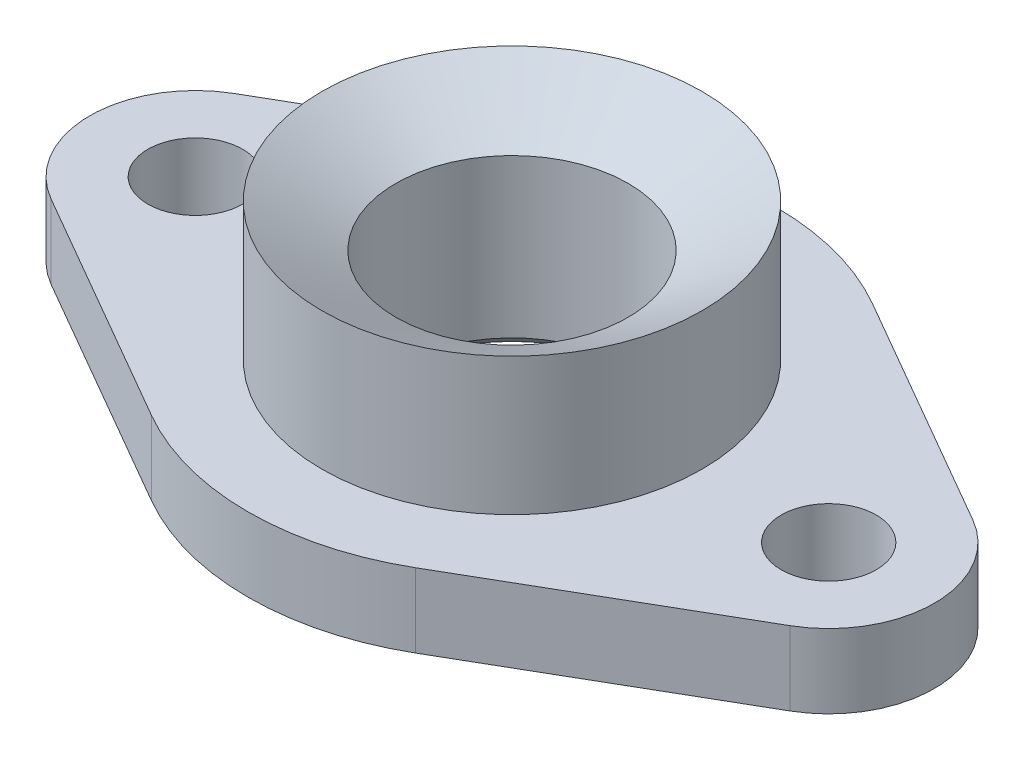
ISO-10303-21;
HEADER;
FILE_DESCRIPTION(('STEP AP214'),'2;1');
FILE_NAME('part.step','',(''),(''),'','','');
FILE_SCHEMA(('AUTOMOTIVE_DESIGN { 1 0 10303 214 1 1 1 1 }'));
ENDSEC;
DATA;
#1=APPLICATION_CONTEXT('core data for automotive mechanical design processes');
#2=APPLICATION_PROTOCOL_DEFINITION('international standard','automotive_design',2000,#1);
#3=PRODUCT_CONTEXT('',#1,'mechanical');
#4=PRODUCT('Part','Part','',(#3));
#5=PRODUCT_RELATED_PRODUCT_CATEGORY('part','',(#4));
#6=PRODUCT_DEFINITION_FORMATION('','',#4);
#7=PRODUCT_DEFINITION_CONTEXT('part definition',#1,'design');
#8=PRODUCT_DEFINITION('design','',#6,#7);
#9=PRODUCT_DEFINITION_SHAPE('','',#8);
#10=(LENGTH_UNIT() NAMED_UNIT(*) SI_UNIT(.MILLI.,.METRE.));
#11=(NAMED_UNIT(*) PLANE_ANGLE_UNIT() SI_UNIT($,.RADIAN.));
#12=(NAMED_UNIT(*) SI_UNIT($,.STERADIAN.) SOLID_ANGLE_UNIT());
#13=UNCERTAINTY_MEASURE_WITH_UNIT(LENGTH_MEASURE(1.E-05),#10,'distance_accuracy_value','');
#14=(GEOMETRIC_REPRESENTATION_CONTEXT(3) GLOBAL_UNCERTAINTY_ASSIGNED_CONTEXT((#13)) GLOBAL_UNIT_ASSIGNED_CONTEXT((#10,
#11,#12)) REPRESENTATION_CONTEXT('',''));
#15=CARTESIAN_POINT('',(0.,0.,0.));
#16=DIRECTION('',(0.,0.,1.));
#17=DIRECTION('',(1.,0.,0.));
#18=AXIS2_PLACEMENT_3D('',#15,#16,#17);
#19=CARTESIAN_POINT('',(0.,0.,0.));
#20=DIRECTION('',(0.,1.,0.));
#21=DIRECTION('',(0.,0.,1.));
#22=AXIS2_PLACEMENT_3D('',#19,#20,#21);
#23=PLANE('',#22);
#24=CARTESIAN_POINT('',(0.,0.,0.));
#25=DIRECTION('',(0.,1.,0.));
#26=DIRECTION('',(0.,0.,1.));
#27=AXIS2_PLACEMENT_3D('',#24,#25,#26);
#28=CIRCLE('',#27,12.);
#29=CARTESIAN_POINT('',(0.,0.,12.));
#30=VERTEX_POINT('',#29);
#31=EDGE_CURVE('E11',#30,#30,#28,.T.);
#32=ORIENTED_EDGE('',*,*,#31,.T.);
#33=EDGE_LOOP('',(#32));
#34=FACE_BOUND('',#33,.T.);
#35=CARTESIAN_POINT('',(30.,0.,0.));
#36=DIRECTION('',(0.,1.,0.));
#37=DIRECTION('',(0.,0.,1.));
#38=AXIS2_PLACEMENT_3D('',#35,#36,#37);
#39=CIRCLE('',#38,4.5);
#40=CARTESIAN_POINT('',(30.,0.,4.49999999999999));
#41=VERTEX_POINT('',#40);
#42=EDGE_CURVE('E238',#41,#41,#39,.T.);
#43=ORIENTED_EDGE('',*,*,#42,.T.);
#44=EDGE_LOOP('',(#43));
#45=FACE_BOUND('',#44,.T.);
#46=CARTESIAN_POINT('',(0.,0.,0.));
#47=DIRECTION('',(0.,1.,0.));
#48=DIRECTION('',(0.,0.,1.));
#49=AXIS2_PLACEMENT_3D('',#46,#47,#48);
#50=CIRCLE('',#49,25.);
#51=CARTESIAN_POINT('',(12.5,0.,-21.650635094611));
#52=VERTEX_POINT('',#51);
#53=CARTESIAN_POINT('',(-12.5,0.,-21.650635094611));
#54=VERTEX_POINT('',#53);
#55=EDGE_CURVE('E133',#52,#54,#50,.T.);
#56=ORIENTED_EDGE('',*,*,#55,.F.);
#57=DIRECTION('',(-0.866025403784439,0.,-0.5));
#58=VECTOR('',#57,1.);
#59=CARTESIAN_POINT('',(12.5,0.,-21.650635094611));
#60=LINE('',#59,#58);
#61=CARTESIAN_POINT('',(35.,0.,-8.6602540378444));
#62=VERTEX_POINT('',#61);
#63=EDGE_CURVE('E86',#62,#52,#60,.T.);
#64=ORIENTED_EDGE('',*,*,#63,.F.);
#65=CARTESIAN_POINT('',(30.,0.,0.));
#66=DIRECTION('',(0.,1.,0.));
#67=DIRECTION('',(0.,0.,-1.));
#68=AXIS2_PLACEMENT_3D('',#65,#66,#67);
#69=CIRCLE('',#68,10.);
#70=CARTESIAN_POINT('',(35.,0.,8.66025403784438));
#71=VERTEX_POINT('',#70);
#72=EDGE_CURVE('E80',#71,#62,#69,.T.);
#73=ORIENTED_EDGE('',*,*,#72,.F.);
#74=DIRECTION('',(0.866025403784438,0.,-0.5));
#75=VECTOR('',#74,1.);
#76=CARTESIAN_POINT('',(12.5,0.,21.650635094611));
#77=LINE('',#76,#75);
#78=CARTESIAN_POINT('',(12.5,0.,21.650635094611));
#79=VERTEX_POINT('',#78);
#80=EDGE_CURVE('E123',#79,#71,#77,.T.);
#81=ORIENTED_EDGE('',*,*,#80,.F.);
#82=CARTESIAN_POINT('',(0.,0.,0.));
#83=DIRECTION('',(0.,1.,0.));
#84=DIRECTION('',(0.,0.,1.));
#85=AXIS2_PLACEMENT_3D('',#82,#83,#84);
#86=CIRCLE('',#85,25.);
#87=CARTESIAN_POINT('',(-12.5,0.,21.650635094611));
#88=VERTEX_POINT('',#87);
#89=EDGE_CURVE('E143',#88,#79,#86,.T.);
#90=ORIENTED_EDGE('',*,*,#89,.F.);
#91=DIRECTION('',(0.866025403784439,0.,0.5));
#92=VECTOR('',#91,1.);
#93=CARTESIAN_POINT('',(-35.,0.,8.66025403784439));
#94=LINE('',#93,#92);
#95=CARTESIAN_POINT('',(-35.,0.,8.66025403784438));
#96=VERTEX_POINT('',#95);
#97=EDGE_CURVE('E141',#96,#88,#94,.T.);
#98=ORIENTED_EDGE('',*,*,#97,.F.);
#99=CARTESIAN_POINT('',(-30.,0.,0.));
#100=DIRECTION('',(0.,1.,0.));
#101=DIRECTION('',(0.,0.,1.));
#102=AXIS2_PLACEMENT_3D('',#99,#100,#101);
#103=CIRCLE('',#102,10.);
#104=CARTESIAN_POINT('',(-35.,0.,-8.66025403784438));
#105=VERTEX_POINT('',#104);
#106=EDGE_CURVE('E139',#105,#96,#103,.T.);
#107=ORIENTED_EDGE('',*,*,#106,.F.);
#108=DIRECTION('',(-0.866025403784438,0.,0.500000000000001));
#109=VECTOR('',#108,1.);
#110=CARTESIAN_POINT('',(-12.5,0.,-21.650635094611));
#111=LINE('',#110,#109);
#112=EDGE_CURVE('E136',#54,#105,#111,.T.);
#113=ORIENTED_EDGE('',*,*,#112,.F.);
#114=EDGE_LOOP('',(#56,#64,#73,#81,#90,#98,#107,#113));
#115=FACE_BOUND('',#114,.T.);
#116=CARTESIAN_POINT('',(-30.,0.,0.));
#117=DIRECTION('',(0.,1.,0.));
#118=DIRECTION('',(0.,0.,1.));
#119=AXIS2_PLACEMENT_3D('',#116,#117,#118);
#120=CIRCLE('',#119,4.5);
#121=CARTESIAN_POINT('',(-30.,0.,4.5));
#122=VERTEX_POINT('',#121);
#123=EDGE_CURVE('E232',#122,#122,#120,.T.);
#124=ORIENTED_EDGE('',*,*,#123,.T.);
#125=EDGE_LOOP('',(#124));
#126=FACE_BOUND('',#125,.T.);
#127=ADVANCED_FACE('F34',(#34,#45,#115,#126),#23,.F.);
#128=CARTESIAN_POINT('',(0.,7.,0.));
#129=DIRECTION('',(0.,1.,0.));
#130=DIRECTION('',(0.,0.,1.));
#131=AXIS2_PLACEMENT_3D('',#128,#129,#130);
#132=PLANE('',#131);
#133=CARTESIAN_POINT('',(30.,7.,0.));
#134=DIRECTION('',(0.,1.,0.));
#135=DIRECTION('',(0.,0.,1.));
#136=AXIS2_PLACEMENT_3D('',#133,#134,#135);
#137=CIRCLE('',#136,4.5);
#138=CARTESIAN_POINT('',(30.,7.,4.49999999999999));
#139=VERTEX_POINT('',#138);
#140=EDGE_CURVE('E235',#139,#139,#137,.T.);
#141=ORIENTED_EDGE('',*,*,#140,.F.);
#142=EDGE_LOOP('',(#141));
#143=FACE_BOUND('',#142,.T.);
#144=CARTESIAN_POINT('',(0.,7.,0.));
#145=DIRECTION('',(0.,1.,0.));
#146=DIRECTION('',(0.,0.,1.));
#147=AXIS2_PLACEMENT_3D('',#144,#145,#146);
#148=CIRCLE('',#147,25.);
#149=CARTESIAN_POINT('',(12.5,7.,-21.650635094611));
#150=VERTEX_POINT('',#149);
#151=CARTESIAN_POINT('',(-12.5,7.,-21.650635094611));
#152=VERTEX_POINT('',#151);
#153=EDGE_CURVE('E148',#150,#152,#148,.T.);
#154=ORIENTED_EDGE('',*,*,#153,.T.);
#155=DIRECTION('',(-0.866025403784438,0.,0.500000000000001));
#156=VECTOR('',#155,1.);
#157=CARTESIAN_POINT('',(-12.5,7.,-21.650635094611));
#158=LINE('',#157,#156);
#159=CARTESIAN_POINT('',(-35.,7.,-8.66025403784438));
#160=VERTEX_POINT('',#159);
#161=EDGE_CURVE('E95',#152,#160,#158,.T.);
#162=ORIENTED_EDGE('',*,*,#161,.T.);
#163=CARTESIAN_POINT('',(-30.,7.,0.));
#164=DIRECTION('',(0.,1.,0.));
#165=DIRECTION('',(0.,0.,1.));
#166=AXIS2_PLACEMENT_3D('',#163,#164,#165);
#167=CIRCLE('',#166,10.);
#168=CARTESIAN_POINT('',(-35.,7.,8.66025403784438));
#169=VERTEX_POINT('',#168);
#170=EDGE_CURVE('E224',#160,#169,#167,.T.);
#171=ORIENTED_EDGE('',*,*,#170,.T.);
#172=DIRECTION('',(0.866025403784439,0.,0.5));
#173=VECTOR('',#172,1.);
#174=CARTESIAN_POINT('',(-35.,7.,8.66025403784439));
#175=LINE('',#174,#173);
#176=CARTESIAN_POINT('',(-12.5,7.,21.650635094611));
#177=VERTEX_POINT('',#176);
#178=EDGE_CURVE('E226',#169,#177,#175,.T.);
#179=ORIENTED_EDGE('',*,*,#178,.T.);
#180=CARTESIAN_POINT('',(0.,7.,0.));
#181=DIRECTION('',(0.,1.,0.));
#182=DIRECTION('',(0.,0.,1.));
#183=AXIS2_PLACEMENT_3D('',#180,#181,#182);
#184=CIRCLE('',#183,25.);
#185=CARTESIAN_POINT('',(12.5,7.,21.650635094611));
#186=VERTEX_POINT('',#185);
#187=EDGE_CURVE('E115',#177,#186,#184,.T.);
#188=ORIENTED_EDGE('',*,*,#187,.T.);
#189=DIRECTION('',(0.866025403784438,0.,-0.5));
#190=VECTOR('',#189,1.);
#191=CARTESIAN_POINT('',(12.5,7.,21.650635094611));
#192=LINE('',#191,#190);
#193=CARTESIAN_POINT('',(35.,7.,8.66025403784438));
#194=VERTEX_POINT('',#193);
#195=EDGE_CURVE('E108',#186,#194,#192,.T.);
#196=ORIENTED_EDGE('',*,*,#195,.T.);
#197=CARTESIAN_POINT('',(30.,7.,0.));
#198=DIRECTION('',(0.,1.,0.));
#199=DIRECTION('',(0.,0.,-1.));
#200=AXIS2_PLACEMENT_3D('',#197,#198,#199);
#201=CIRCLE('',#200,10.);
#202=CARTESIAN_POINT('',(35.,7.,-8.6602540378444));
#203=VERTEX_POINT('',#202);
#204=EDGE_CURVE('E113',#194,#203,#201,.T.);
#205=ORIENTED_EDGE('',*,*,#204,.T.);
#206=DIRECTION('',(-0.866025403784439,0.,-0.5));
#207=VECTOR('',#206,1.);
#208=CARTESIAN_POINT('',(12.5,7.,-21.650635094611));
#209=LINE('',#208,#207);
#210=EDGE_CURVE('E51',#203,#150,#209,.T.);
#211=ORIENTED_EDGE('',*,*,#210,.T.);
#212=EDGE_LOOP('',(#154,#162,#171,#179,#188,#196,#205,#211));
#213=FACE_BOUND('',#212,.T.);
#214=CARTESIAN_POINT('',(-30.,7.,0.));
#215=DIRECTION('',(0.,1.,0.));
#216=DIRECTION('',(0.,0.,1.));
#217=AXIS2_PLACEMENT_3D('',#214,#215,#216);
#218=CIRCLE('',#217,4.5);
#219=CARTESIAN_POINT('',(-30.,7.,4.5));
#220=VERTEX_POINT('',#219);
#221=EDGE_CURVE('E137',#220,#220,#218,.T.);
#222=ORIENTED_EDGE('',*,*,#221,.F.);
#223=EDGE_LOOP('',(#222));
#224=FACE_BOUND('',#223,.T.);
#225=CARTESIAN_POINT('',(0.,7.,0.));
#226=DIRECTION('',(0.,1.,0.));
#227=DIRECTION('',(0.,0.,1.));
#228=AXIS2_PLACEMENT_3D('',#225,#226,#227);
#229=CIRCLE('',#228,18.);
#230=CARTESIAN_POINT('',(0.,7.,-18.));
#231=VERTEX_POINT('',#230);
#232=EDGE_CURVE('E241',#231,#231,#229,.T.);
#233=ORIENTED_EDGE('',*,*,#232,.F.);
#234=EDGE_LOOP('',(#233));
#235=FACE_BOUND('',#234,.T.);
#236=ADVANCED_FACE('F110',(#143,#213,#224,#235),#132,.T.);
#237=CARTESIAN_POINT('',(0.,7.,0.));
#238=DIRECTION('',(0.,-1.,0.));
#239=DIRECTION('',(0.,0.,-1.));
#240=AXIS2_PLACEMENT_3D('',#237,#238,#239);
#241=CYLINDRICAL_SURFACE('',#240,25.);
#242=ORIENTED_EDGE('',*,*,#55,.T.);
#243=DIRECTION('',(0.,-1.,0.));
#244=VECTOR('',#243,1.);
#245=CARTESIAN_POINT('',(-12.5,7.,-21.650635094611));
#246=LINE('',#245,#244);
#247=EDGE_CURVE('E161',#152,#54,#246,.T.);
#248=ORIENTED_EDGE('',*,*,#247,.F.);
#249=ORIENTED_EDGE('',*,*,#153,.F.);
#250=DIRECTION('',(0.,-1.,0.));
#251=VECTOR('',#250,1.);
#252=CARTESIAN_POINT('',(12.5,7.,-21.650635094611));
#253=LINE('',#252,#251);
#254=EDGE_CURVE('E129',#150,#52,#253,.T.);
#255=ORIENTED_EDGE('',*,*,#254,.T.);
#256=EDGE_LOOP('',(#242,#248,#249,#255));
#257=FACE_BOUND('',#256,.T.);
#258=ADVANCED_FACE('F183',(#257),#241,.T.);
#259=CARTESIAN_POINT('',(-12.5,7.,-21.650635094611));
#260=DIRECTION('',(0.500000000000001,0.,0.866025403784438));
#261=DIRECTION('',(0.866025403784438,0.,-0.500000000000001));
#262=AXIS2_PLACEMENT_3D('',#259,#260,#261);
#263=PLANE('',#262);
#264=ORIENTED_EDGE('',*,*,#112,.T.);
#265=DIRECTION('',(0.,-1.,0.));
#266=VECTOR('',#265,1.);
#267=CARTESIAN_POINT('',(-35.,7.,-8.66025403784438));
#268=LINE('',#267,#266);
#269=EDGE_CURVE('E158',#160,#105,#268,.T.);
#270=ORIENTED_EDGE('',*,*,#269,.F.);
#271=ORIENTED_EDGE('',*,*,#161,.F.);
#272=ORIENTED_EDGE('',*,*,#247,.T.);
#273=EDGE_LOOP('',(#264,#270,#271,#272));
#274=FACE_BOUND('',#273,.T.);
#275=ADVANCED_FACE('F208',(#274),#263,.F.);
#276=CARTESIAN_POINT('',(-30.,7.,0.));
#277=DIRECTION('',(0.,-1.,0.));
#278=DIRECTION('',(0.,0.,-1.));
#279=AXIS2_PLACEMENT_3D('',#276,#277,#278);
#280=CYLINDRICAL_SURFACE('',#279,10.);
#281=ORIENTED_EDGE('',*,*,#106,.T.);
#282=DIRECTION('',(0.,-1.,0.));
#283=VECTOR('',#282,1.);
#284=CARTESIAN_POINT('',(-35.,7.,8.66025403784438));
#285=LINE('',#284,#283);
#286=EDGE_CURVE('E155',#169,#96,#285,.T.);
#287=ORIENTED_EDGE('',*,*,#286,.F.);
#288=ORIENTED_EDGE('',*,*,#170,.F.);
#289=ORIENTED_EDGE('',*,*,#269,.T.);
#290=EDGE_LOOP('',(#281,#287,#288,#289));
#291=FACE_BOUND('',#290,.T.);
#292=ADVANCED_FACE('F204',(#291),#280,.T.);
#293=CARTESIAN_POINT('',(-35.,7.,8.66025403784439));
#294=DIRECTION('',(0.5,0.,-0.866025403784439));
#295=DIRECTION('',(-0.866025403784439,0.,-0.5));
#296=AXIS2_PLACEMENT_3D('',#293,#294,#295);
#297=PLANE('',#296);
#298=ORIENTED_EDGE('',*,*,#97,.T.);
#299=DIRECTION('',(0.,-1.,0.));
#300=VECTOR('',#299,1.);
#301=CARTESIAN_POINT('',(-12.5,7.,21.650635094611));
#302=LINE('',#301,#300);
#303=EDGE_CURVE('E152',#177,#88,#302,.T.);
#304=ORIENTED_EDGE('',*,*,#303,.F.);
#305=ORIENTED_EDGE('',*,*,#178,.F.);
#306=ORIENTED_EDGE('',*,*,#286,.T.);
#307=EDGE_LOOP('',(#298,#304,#305,#306));
#308=FACE_BOUND('',#307,.T.);
#309=ADVANCED_FACE('F200',(#308),#297,.F.);
#310=CARTESIAN_POINT('',(0.,7.,0.));
#311=DIRECTION('',(0.,-1.,0.));
#312=DIRECTION('',(0.,0.,-1.));
#313=AXIS2_PLACEMENT_3D('',#310,#311,#312);
#314=CYLINDRICAL_SURFACE('',#313,25.);
#315=ORIENTED_EDGE('',*,*,#89,.T.);
#316=DIRECTION('',(0.,-1.,0.));
#317=VECTOR('',#316,1.);
#318=CARTESIAN_POINT('',(12.5,7.,21.650635094611));
#319=LINE('',#318,#317);
#320=EDGE_CURVE('E124',#186,#79,#319,.T.);
#321=ORIENTED_EDGE('',*,*,#320,.F.);
#322=ORIENTED_EDGE('',*,*,#187,.F.);
#323=ORIENTED_EDGE('',*,*,#303,.T.);
#324=EDGE_LOOP('',(#315,#321,#322,#323));
#325=FACE_BOUND('',#324,.T.);
#326=ADVANCED_FACE('F197',(#325),#314,.T.);
#327=CARTESIAN_POINT('',(12.5,7.,21.650635094611));
#328=DIRECTION('',(-0.5,0.,-0.866025403784438));
#329=DIRECTION('',(-0.866025403784438,0.,0.5));
#330=AXIS2_PLACEMENT_3D('',#327,#328,#329);
#331=PLANE('',#330);
#332=ORIENTED_EDGE('',*,*,#80,.T.);
#333=DIRECTION('',(0.,-1.,0.));
#334=VECTOR('',#333,1.);
#335=CARTESIAN_POINT('',(35.,7.,8.66025403784438));
#336=LINE('',#335,#334);
#337=EDGE_CURVE('E120',#194,#71,#336,.T.);
#338=ORIENTED_EDGE('',*,*,#337,.F.);
#339=ORIENTED_EDGE('',*,*,#195,.F.);
#340=ORIENTED_EDGE('',*,*,#320,.T.);
#341=EDGE_LOOP('',(#332,#338,#339,#340));
#342=FACE_BOUND('',#341,.T.);
#343=ADVANCED_FACE('F121',(#342),#331,.F.);
#344=CARTESIAN_POINT('',(30.,7.,0.));
#345=DIRECTION('',(0.,-1.,0.));
#346=DIRECTION('',(0.,0.,-1.));
#347=AXIS2_PLACEMENT_3D('',#344,#345,#346);
#348=CYLINDRICAL_SURFACE('',#347,10.);
#349=ORIENTED_EDGE('',*,*,#72,.T.);
#350=DIRECTION('',(0.,-1.,0.));
#351=VECTOR('',#350,1.);
#352=CARTESIAN_POINT('',(35.,7.,-8.6602540378444));
#353=LINE('',#352,#351);
#354=EDGE_CURVE('E125',#203,#62,#353,.T.);
#355=ORIENTED_EDGE('',*,*,#354,.F.);
#356=ORIENTED_EDGE('',*,*,#204,.F.);
#357=ORIENTED_EDGE('',*,*,#337,.T.);
#358=EDGE_LOOP('',(#349,#355,#356,#357));
#359=FACE_BOUND('',#358,.T.);
#360=ADVANCED_FACE('F127',(#359),#348,.T.);
#361=CARTESIAN_POINT('',(12.5,7.,-21.650635094611));
#362=DIRECTION('',(-0.5,0.,0.866025403784439));
#363=DIRECTION('',(0.866025403784439,0.,0.5));
#364=AXIS2_PLACEMENT_3D('',#361,#362,#363);
#365=PLANE('',#364);
#366=ORIENTED_EDGE('',*,*,#63,.T.);
#367=ORIENTED_EDGE('',*,*,#254,.F.);
#368=ORIENTED_EDGE('',*,*,#210,.F.);
#369=ORIENTED_EDGE('',*,*,#354,.T.);
#370=EDGE_LOOP('',(#366,#367,#368,#369));
#371=FACE_BOUND('',#370,.T.);
#372=ADVANCED_FACE('F189',(#371),#365,.F.);
#373=CARTESIAN_POINT('',(-30.,7.,0.));
#374=DIRECTION('',(0.,-1.,0.));
#375=DIRECTION('',(0.,0.,-1.));
#376=AXIS2_PLACEMENT_3D('',#373,#374,#375);
#377=CYLINDRICAL_SURFACE('',#376,4.5);
#378=ORIENTED_EDGE('',*,*,#221,.T.);
#379=EDGE_LOOP('',(#378));
#380=FACE_BOUND('',#379,.T.);
#381=ORIENTED_EDGE('',*,*,#123,.F.);
#382=EDGE_LOOP('',(#381));
#383=FACE_BOUND('',#382,.T.);
#384=ADVANCED_FACE('F192',(#380,#383),#377,.F.);
#385=CARTESIAN_POINT('',(30.,7.,0.));
#386=DIRECTION('',(0.,-1.,0.));
#387=DIRECTION('',(0.,0.,-1.));
#388=AXIS2_PLACEMENT_3D('',#385,#386,#387);
#389=CYLINDRICAL_SURFACE('',#388,4.5);
#390=ORIENTED_EDGE('',*,*,#140,.T.);
#391=EDGE_LOOP('',(#390));
#392=FACE_BOUND('',#391,.T.);
#393=ORIENTED_EDGE('',*,*,#42,.F.);
#394=EDGE_LOOP('',(#393));
#395=FACE_BOUND('',#394,.T.);
#396=ADVANCED_FACE('F257',(#392,#395),#389,.F.);
#397=CARTESIAN_POINT('',(0.,20.,0.));
#398=DIRECTION('',(0.,-1.,0.));
#399=DIRECTION('',(0.,0.,-1.));
#400=AXIS2_PLACEMENT_3D('',#397,#398,#399);
#401=CYLINDRICAL_SURFACE('',#400,18.);
#402=CARTESIAN_POINT('',(0.,20.,0.));
#403=DIRECTION('',(0.,-1.,0.));
#404=DIRECTION('',(0.,0.,-1.));
#405=AXIS2_PLACEMENT_3D('',#402,#403,#404);
#406=CIRCLE('',#405,18.);
#407=CARTESIAN_POINT('',(0.,20.,-18.));
#408=VERTEX_POINT('',#407);
#409=EDGE_CURVE('E249',#408,#408,#406,.T.);
#410=CARTESIAN_POINT('',(0.,20.,-18.));
#411=CARTESIAN_POINT('',(0.,19.8645833333333,-18.));
#412=CARTESIAN_POINT('',(0.,19.7291666666667,-18.));
#413=CARTESIAN_POINT('',(0.,19.4583333333333,-18.));
#414=CARTESIAN_POINT('',(0.,19.3229166666667,-18.));
#415=CARTESIAN_POINT('',(0.,19.0520833333333,-18.));
#416=CARTESIAN_POINT('',(0.,18.9166666666667,-18.));
#417=CARTESIAN_POINT('',(0.,18.6458333333333,-18.));
#418=CARTESIAN_POINT('',(0.,18.5104166666667,-18.));
#419=CARTESIAN_POINT('',(0.,18.2395833333333,-18.));
#420=CARTESIAN_POINT('',(0.,18.1041666666667,-18.));
#421=CARTESIAN_POINT('',(0.,17.8333333333333,-18.));
#422=CARTESIAN_POINT('',(0.,17.6979166666667,-18.));
#423=CARTESIAN_POINT('',(0.,17.4270833333333,-18.));
#424=CARTESIAN_POINT('',(0.,17.2916666666667,-18.));
#425=CARTESIAN_POINT('',(0.,17.0208333333333,-18.));
#426=CARTESIAN_POINT('',(0.,16.8854166666667,-18.));
#427=CARTESIAN_POINT('',(0.,16.6145833333333,-18.));
#428=CARTESIAN_POINT('',(0.,16.4791666666667,-18.));
#429=CARTESIAN_POINT('',(0.,16.2083333333333,-18.));
#430=CARTESIAN_POINT('',(0.,16.0729166666667,-18.));
#431=CARTESIAN_POINT('',(0.,15.8020833333333,-18.));
#432=CARTESIAN_POINT('',(0.,15.6666666666667,-18.));
#433=CARTESIAN_POINT('',(0.,15.3958333333333,-18.));
#434=CARTESIAN_POINT('',(0.,15.2604166666667,-18.));
#435=CARTESIAN_POINT('',(0.,14.9895833333333,-18.));
#436=CARTESIAN_POINT('',(0.,14.8541666666667,-18.));
#437=CARTESIAN_POINT('',(0.,14.5833333333333,-18.));
#438=CARTESIAN_POINT('',(0.,14.4479166666667,-18.));
#439=CARTESIAN_POINT('',(0.,14.1770833333333,-18.));
#440=CARTESIAN_POINT('',(0.,14.0416666666667,-18.));
#441=CARTESIAN_POINT('',(0.,13.7708333333333,-18.));
#442=CARTESIAN_POINT('',(0.,13.6354166666667,-18.));
#443=CARTESIAN_POINT('',(0.,13.3645833333333,-18.));
#444=CARTESIAN_POINT('',(0.,13.2291666666667,-18.));
#445=CARTESIAN_POINT('',(0.,12.9583333333333,-18.));
#446=CARTESIAN_POINT('',(0.,12.8229166666667,-18.));
#447=CARTESIAN_POINT('',(0.,12.5520833333333,-18.));
#448=CARTESIAN_POINT('',(0.,12.4166666666667,-18.));
#449=CARTESIAN_POINT('',(0.,12.1458333333333,-18.));
#450=CARTESIAN_POINT('',(0.,12.0104166666667,-18.));
#451=CARTESIAN_POINT('',(0.,11.7395833333333,-18.));
#452=CARTESIAN_POINT('',(0.,11.6041666666667,-18.));
#453=CARTESIAN_POINT('',(0.,11.3333333333333,-18.));
#454=CARTESIAN_POINT('',(0.,11.1979166666667,-18.));
#455=CARTESIAN_POINT('',(0.,10.9270833333333,-18.));
#456=CARTESIAN_POINT('',(0.,10.7916666666667,-18.));
#457=CARTESIAN_POINT('',(0.,10.5208333333333,-18.));
#458=CARTESIAN_POINT('',(0.,10.3854166666667,-18.));
#459=CARTESIAN_POINT('',(0.,10.1145833333333,-18.));
#460=CARTESIAN_POINT('',(0.,9.97916666666667,-18.));
#461=CARTESIAN_POINT('',(0.,9.70833333333333,-18.));
#462=CARTESIAN_POINT('',(0.,9.57291666666667,-18.));
#463=CARTESIAN_POINT('',(0.,9.30208333333333,-18.));
#464=CARTESIAN_POINT('',(0.,9.16666666666667,-18.));
#465=CARTESIAN_POINT('',(0.,8.89583333333333,-18.));
#466=CARTESIAN_POINT('',(0.,8.76041666666667,-18.));
#467=CARTESIAN_POINT('',(0.,8.48958333333334,-18.));
#468=CARTESIAN_POINT('',(0.,8.35416666666667,-18.));
#469=CARTESIAN_POINT('',(0.,8.08333333333333,-18.));
#470=CARTESIAN_POINT('',(0.,7.94791666666667,-18.));
#471=CARTESIAN_POINT('',(0.,7.67708333333333,-18.));
#472=CARTESIAN_POINT('',(0.,7.54166666666667,-18.));
#473=CARTESIAN_POINT('',(0.,7.27083333333333,-18.));
#474=CARTESIAN_POINT('',(0.,7.13541666666667,-18.));
#475=CARTESIAN_POINT('',(0.,7.,-18.));
#476=B_SPLINE_CURVE_WITH_KNOTS('',3,(#410,#411,#412,#413,#414,#415,#416,#417,#418,#419,#420,
#421,#422,#423,#424,#425,#426,#427,#428,#429,#430,#431,#432,#433,#434,#435,#436,#437,#438,#439,
#440,#441,#442,#443,#444,#445,#446,#447,#448,#449,#450,#451,#452,#453,#454,#455,#456,#457,#458,
#459,#460,#461,#462,#463,#464,#465,#466,#467,#468,#469,#470,#471,#472,#473,#474,#475),
.UNSPECIFIED.,.F.,.F.,(4,2,2,2,2,2,2,2,2,2,2,2,2,2,2,2,2,2,2,2,2,2,2,2,2,2,2,2,2,2,2,2,4),(0.,
0.406249999999997,0.812499999999997,1.21875,1.625,2.03125,2.4375,2.84375,3.25,3.65625,4.0625,
4.46875,4.875,5.28125,5.6875,6.09375,6.5,6.90625,7.3125,7.71875,8.125,8.53125,8.9375,9.34375,
9.75,10.15625,10.5625,10.96875,11.375,11.78125,12.1875,12.59375,13.),.UNSPECIFIED.);
#477=EDGE_CURVE('BSEAM253',#408,#231,#476,.T.);
#478=ORIENTED_EDGE('',*,*,#409,.T.);
#479=ORIENTED_EDGE('',*,*,#232,.T.);
#480=ORIENTED_EDGE('',*,*,#477,.T.);
#481=ORIENTED_EDGE('',*,*,#477,.F.);
#482=EDGE_LOOP('',(#478,#480,#479,#481));
#483=FACE_BOUND('',#482,.T.);
#484=ADVANCED_FACE('F253',(#483),#401,.T.);
#485=CARTESIAN_POINT('',(0.,-9.57579830366831,0.));
#486=DIRECTION('',(0.,-1.,0.));
#487=DIRECTION('',(0.,0.,-1.));
#488=AXIS2_PLACEMENT_3D('',#485,#486,#487);
#489=CYLINDRICAL_SURFACE('',#488,11.);
#490=CARTESIAN_POINT('',(0.,0.99999999999999,0.));
#491=DIRECTION('',(0.,1.,0.));
#492=DIRECTION('',(0.,0.,1.));
#493=AXIS2_PLACEMENT_3D('',#490,#491,#492);
#494=CIRCLE('',#493,11.);
#495=CARTESIAN_POINT('',(0.,0.99999999999999,11.));
#496=VERTEX_POINT('',#495);
#497=EDGE_CURVE('E43',#496,#496,#494,.F.);
#498=ORIENTED_EDGE('',*,*,#497,.T.);
#499=EDGE_LOOP('',(#498));
#500=FACE_BOUND('',#499,.T.);
#501=CARTESIAN_POINT('',(0.,15.9585481156726,0.));
#502=DIRECTION('',(0.,-1.,0.));
#503=DIRECTION('',(0.,0.,-1.));
#504=AXIS2_PLACEMENT_3D('',#501,#502,#503);
#505=CIRCLE('',#504,11.);
#506=CARTESIAN_POINT('',(0.,15.9585481156726,-11.));
#507=VERTEX_POINT('',#506);
#508=EDGE_CURVE('E246',#507,#507,#505,.T.);
#509=ORIENTED_EDGE('',*,*,#508,.F.);
#510=EDGE_LOOP('',(#509));
#511=FACE_BOUND('',#510,.T.);
#512=ADVANCED_FACE('F165',(#500,#511),#489,.F.);
#513=CARTESIAN_POINT('',(0.,20.,0.));
#514=DIRECTION('',(0.,1.,0.));
#515=DIRECTION('',(0.,0.,1.));
#516=AXIS2_PLACEMENT_3D('',#513,#514,#515);
#517=CONICAL_SURFACE('',#516,18.,1.0471975511966);
#518=ORIENTED_EDGE('',*,*,#508,.T.);
#519=EDGE_LOOP('',(#518));
#520=FACE_BOUND('',#519,.T.);
#521=ORIENTED_EDGE('',*,*,#409,.F.);
#522=EDGE_LOOP('',(#521));
#523=FACE_BOUND('',#522,.T.);
#524=ADVANCED_FACE('F169',(#520,#523),#517,.F.);
#525=CARTESIAN_POINT('',(0.,0.99999999999999,0.));
#526=DIRECTION('',(0.,-1.,0.));
#527=DIRECTION('',(0.,0.,-1.));
#528=AXIS2_PLACEMENT_3D('',#525,#526,#527);
#529=CONICAL_SURFACE('',#528,11.,0.785398163397451);
#530=ORIENTED_EDGE('',*,*,#31,.F.);
#531=EDGE_LOOP('',(#530));
#532=FACE_BOUND('',#531,.T.);
#533=ORIENTED_EDGE('',*,*,#497,.F.);
#534=EDGE_LOOP('',(#533));
#535=FACE_BOUND('',#534,.T.);
#536=ADVANCED_FACE('F36',(#532,#535),#529,.F.);
#537=CLOSED_SHELL('',(#127,#236,#258,#275,#292,#309,#326,#343,#360,#372,#384,#396,#484,#512,
#524,#536));
#538=MANIFOLD_SOLID_BREP('B2',#537);
#539=ADVANCED_BREP_SHAPE_REPRESENTATION('',(#18,#538),#14);
#540=SHAPE_DEFINITION_REPRESENTATION(#9,#539);
ENDSEC;
END-ISO-10303-21;
